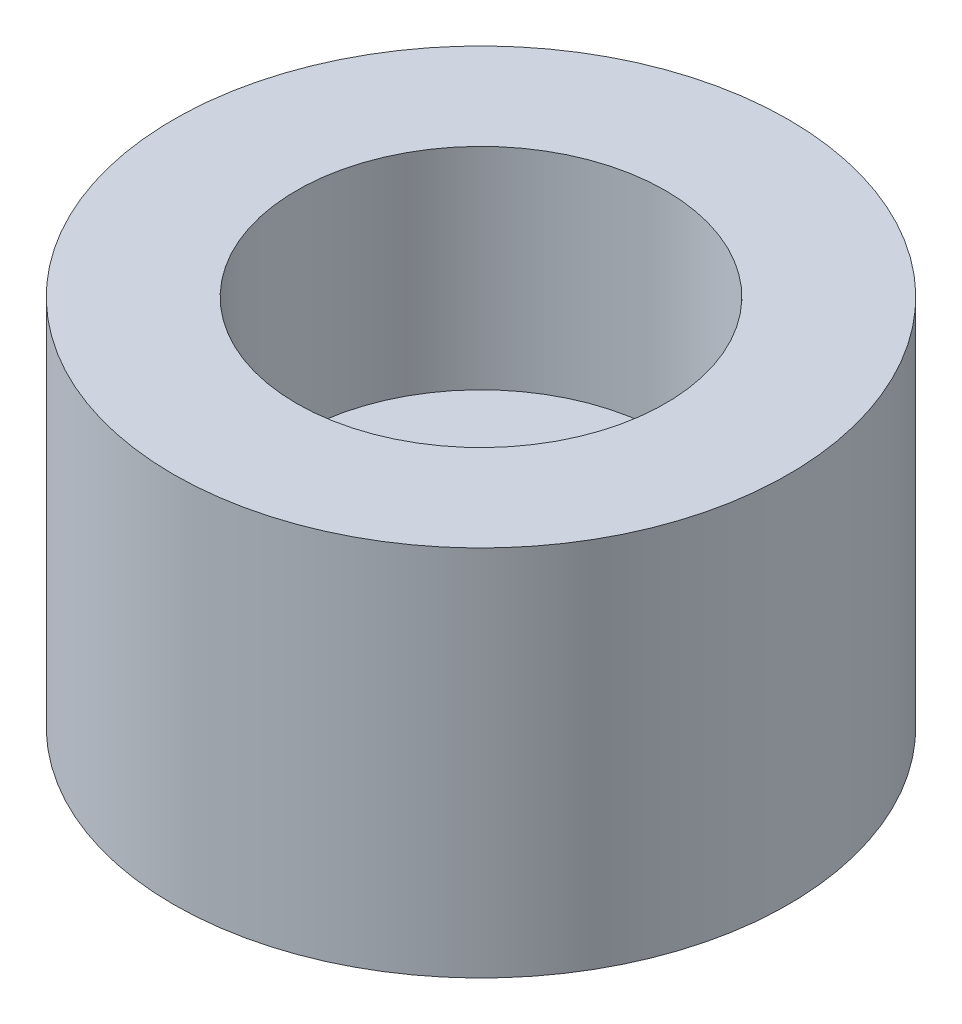
ISO-10303-21;
HEADER;
FILE_DESCRIPTION(('STEP AP214'),'2;1');
FILE_NAME('part.step','',(''),(''),'','','');
FILE_SCHEMA(('AUTOMOTIVE_DESIGN { 1 0 10303 214 1 1 1 1 }'));
ENDSEC;
DATA;
#1=APPLICATION_CONTEXT('core data for automotive mechanical design processes');
#2=APPLICATION_PROTOCOL_DEFINITION('international standard','automotive_design',2000,#1);
#3=PRODUCT_CONTEXT('',#1,'mechanical');
#4=PRODUCT('Part','Part','',(#3));
#5=PRODUCT_RELATED_PRODUCT_CATEGORY('part','',(#4));
#6=PRODUCT_DEFINITION_FORMATION('','',#4);
#7=PRODUCT_DEFINITION_CONTEXT('part definition',#1,'design');
#8=PRODUCT_DEFINITION('design','',#6,#7);
#9=PRODUCT_DEFINITION_SHAPE('','',#8);
#10=(LENGTH_UNIT() NAMED_UNIT(*) SI_UNIT(.MILLI.,.METRE.));
#11=(NAMED_UNIT(*) PLANE_ANGLE_UNIT() SI_UNIT($,.RADIAN.));
#12=(NAMED_UNIT(*) SI_UNIT($,.STERADIAN.) SOLID_ANGLE_UNIT());
#13=UNCERTAINTY_MEASURE_WITH_UNIT(LENGTH_MEASURE(1.E-05),#10,'distance_accuracy_value','');
#14=(GEOMETRIC_REPRESENTATION_CONTEXT(3) GLOBAL_UNCERTAINTY_ASSIGNED_CONTEXT((#13)) GLOBAL_UNIT_ASSIGNED_CONTEXT((#10,
#11,#12)) REPRESENTATION_CONTEXT('',''));
#15=CARTESIAN_POINT('',(0.,0.,0.));
#16=DIRECTION('',(0.,0.,1.));
#17=DIRECTION('',(1.,0.,0.));
#18=AXIS2_PLACEMENT_3D('',#15,#16,#17);
#19=CARTESIAN_POINT('',(0.,3.,0.));
#20=DIRECTION('',(0.,1.,0.));
#21=DIRECTION('',(0.,0.,1.));
#22=AXIS2_PLACEMENT_3D('',#19,#20,#21);
#23=PLANE('',#22);
#24=CARTESIAN_POINT('',(0.,3.,0.));
#25=DIRECTION('',(0.,1.,0.));
#26=DIRECTION('',(0.,0.,1.));
#27=AXIS2_PLACEMENT_3D('',#24,#25,#26);
#28=CIRCLE('',#27,4.375);
#29=CARTESIAN_POINT('',(0.,3.,4.375));
#30=VERTEX_POINT('',#29);
#31=EDGE_CURVE('E10',#30,#30,#28,.T.);
#32=ORIENTED_EDGE('',*,*,#31,.T.);
#33=EDGE_LOOP('',(#32));
#34=FACE_BOUND('',#33,.T.);
#35=CARTESIAN_POINT('',(0.,3.,0.));
#36=DIRECTION('',(0.,1.,0.));
#37=DIRECTION('',(0.,0.,1.));
#38=AXIS2_PLACEMENT_3D('',#35,#36,#37);
#39=CIRCLE('',#38,2.625);
#40=CARTESIAN_POINT('',(0.,3.,2.625));
#41=VERTEX_POINT('',#40);
#42=EDGE_CURVE('E44',#41,#41,#39,.T.);
#43=ORIENTED_EDGE('',*,*,#42,.F.);
#44=EDGE_LOOP('',(#43));
#45=FACE_BOUND('',#44,.T.);
#46=ADVANCED_FACE('F37',(#34,#45),#23,.T.);
#47=CARTESIAN_POINT('',(0.,3.,0.));
#48=DIRECTION('',(0.,-1.,0.));
#49=DIRECTION('',(0.,0.,-1.));
#50=AXIS2_PLACEMENT_3D('',#47,#48,#49);
#51=CYLINDRICAL_SURFACE('',#50,4.375);
#52=ORIENTED_EDGE('',*,*,#31,.F.);
#53=EDGE_LOOP('',(#52));
#54=FACE_BOUND('',#53,.T.);
#55=CARTESIAN_POINT('',(0.,-2.3,0.));
#56=DIRECTION('',(0.,-1.,0.));
#57=DIRECTION('',(0.,0.,-1.));
#58=AXIS2_PLACEMENT_3D('',#55,#56,#57);
#59=CIRCLE('',#58,4.375);
#60=CARTESIAN_POINT('',(0.,-2.3,-4.375));
#61=VERTEX_POINT('',#60);
#62=EDGE_CURVE('E53',#61,#61,#59,.T.);
#63=ORIENTED_EDGE('',*,*,#62,.F.);
#64=EDGE_LOOP('',(#63));
#65=FACE_BOUND('',#64,.T.);
#66=ADVANCED_FACE('F39',(#54,#65),#51,.T.);
#67=CARTESIAN_POINT('',(0.,3.,0.));
#68=DIRECTION('',(0.,-1.,0.));
#69=DIRECTION('',(0.,0.,-1.));
#70=AXIS2_PLACEMENT_3D('',#67,#68,#69);
#71=CYLINDRICAL_SURFACE('',#70,2.625);
#72=ORIENTED_EDGE('',*,*,#42,.T.);
#73=EDGE_LOOP('',(#72));
#74=FACE_BOUND('',#73,.T.);
#75=CARTESIAN_POINT('',(0.,0.,0.));
#76=DIRECTION('',(0.,1.,0.));
#77=DIRECTION('',(0.,0.,1.));
#78=AXIS2_PLACEMENT_3D('',#75,#76,#77);
#79=CIRCLE('',#78,2.625);
#80=CARTESIAN_POINT('',(0.,0.,2.625));
#81=VERTEX_POINT('',#80);
#82=EDGE_CURVE('E48',#81,#81,#79,.T.);
#83=ORIENTED_EDGE('',*,*,#82,.F.);
#84=EDGE_LOOP('',(#83));
#85=FACE_BOUND('',#84,.T.);
#86=ADVANCED_FACE('F77',(#74,#85),#71,.F.);
#87=CARTESIAN_POINT('',(0.,0.,0.));
#88=DIRECTION('',(0.,-1.,0.));
#89=DIRECTION('',(0.,0.,-1.));
#90=AXIS2_PLACEMENT_3D('',#87,#88,#89);
#91=PLANE('',#90);
#92=CARTESIAN_POINT('',(0.,0.,0.));
#93=DIRECTION('',(0.,-1.,0.));
#94=DIRECTION('',(0.,0.,-1.));
#95=AXIS2_PLACEMENT_3D('',#92,#93,#94);
#96=CIRCLE('',#95,1.425);
#97=CARTESIAN_POINT('',(0.,0.,-1.425));
#98=VERTEX_POINT('',#97);
#99=EDGE_CURVE('E58',#98,#98,#96,.T.);
#100=ORIENTED_EDGE('',*,*,#99,.T.);
#101=EDGE_LOOP('',(#100));
#102=FACE_BOUND('',#101,.T.);
#103=ORIENTED_EDGE('',*,*,#82,.T.);
#104=EDGE_LOOP('',(#103));
#105=FACE_BOUND('',#104,.T.);
#106=ADVANCED_FACE('F69',(#102,#105),#91,.F.);
#107=CARTESIAN_POINT('',(0.,-2.3,0.));
#108=DIRECTION('',(0.,-1.,0.));
#109=DIRECTION('',(0.,0.,-1.));
#110=AXIS2_PLACEMENT_3D('',#107,#108,#109);
#111=PLANE('',#110);
#112=ORIENTED_EDGE('',*,*,#62,.T.);
#113=EDGE_LOOP('',(#112));
#114=FACE_BOUND('',#113,.T.);
#115=CARTESIAN_POINT('',(0.,-2.3,0.));
#116=DIRECTION('',(0.,-1.,0.));
#117=DIRECTION('',(0.,0.,-1.));
#118=AXIS2_PLACEMENT_3D('',#115,#116,#117);
#119=CIRCLE('',#118,1.425);
#120=CARTESIAN_POINT('',(0.,-2.3,-1.425));
#121=VERTEX_POINT('',#120);
#122=EDGE_CURVE('E57',#121,#121,#119,.T.);
#123=ORIENTED_EDGE('',*,*,#122,.F.);
#124=EDGE_LOOP('',(#123));
#125=FACE_BOUND('',#124,.T.);
#126=ADVANCED_FACE('F67',(#114,#125),#111,.T.);
#127=CARTESIAN_POINT('',(0.,-2.3,0.));
#128=DIRECTION('',(0.,1.,0.));
#129=DIRECTION('',(0.,0.,1.));
#130=AXIS2_PLACEMENT_3D('',#127,#128,#129);
#131=CYLINDRICAL_SURFACE('',#130,1.425);
#132=ORIENTED_EDGE('',*,*,#122,.T.);
#133=EDGE_LOOP('',(#132));
#134=FACE_BOUND('',#133,.T.);
#135=ORIENTED_EDGE('',*,*,#99,.F.);
#136=EDGE_LOOP('',(#135));
#137=FACE_BOUND('',#136,.T.);
#138=ADVANCED_FACE('F64',(#134,#137),#131,.F.);
#139=CLOSED_SHELL('',(#46,#66,#86,#106,#126,#138));
#140=MANIFOLD_SOLID_BREP('B2',#139);
#141=ADVANCED_BREP_SHAPE_REPRESENTATION('',(#18,#140),#14);
#142=SHAPE_DEFINITION_REPRESENTATION(#9,#141);
ENDSEC;
END-ISO-10303-21;
